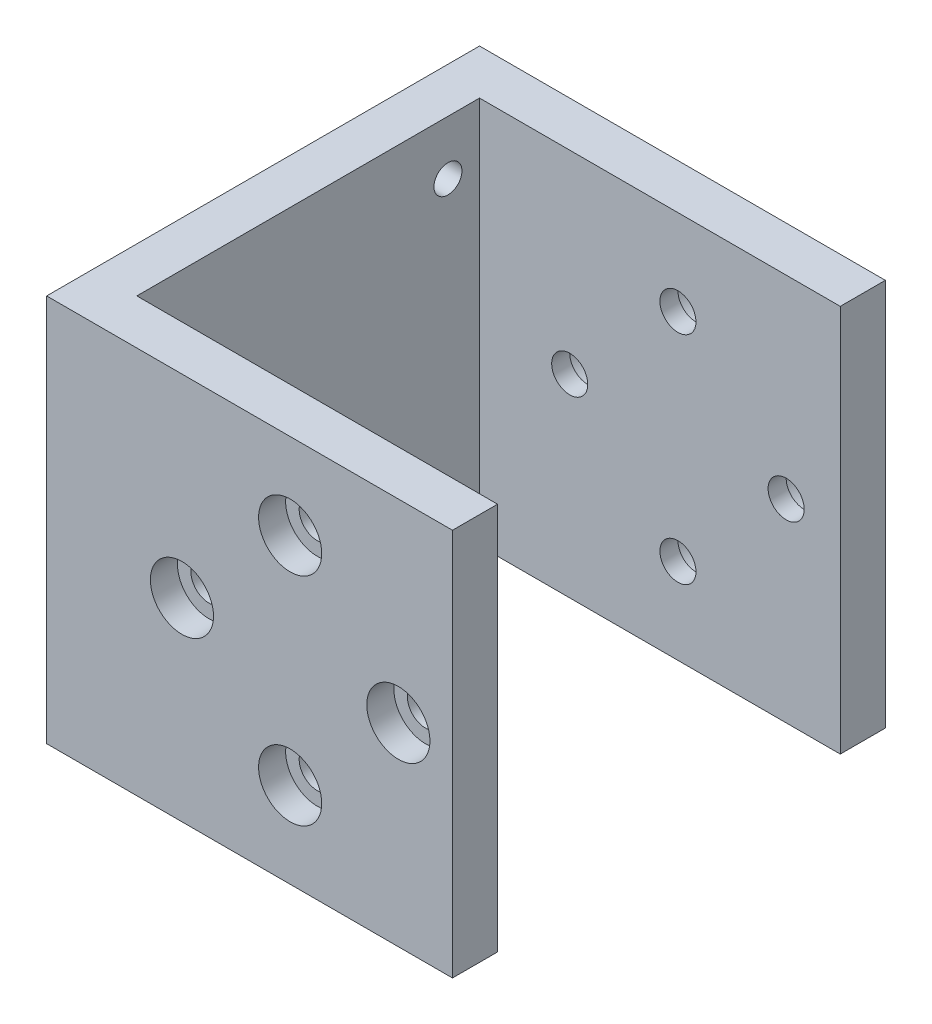
ISO-10303-21;
HEADER;
FILE_DESCRIPTION(('STEP AP214'),'2;1');
FILE_NAME('part.step','',(''),(''),'','','');
FILE_SCHEMA(('AUTOMOTIVE_DESIGN { 1 0 10303 214 1 1 1 1 }'));
ENDSEC;
DATA;
#1=APPLICATION_CONTEXT('core data for automotive mechanical design processes');
#2=APPLICATION_PROTOCOL_DEFINITION('international standard','automotive_design',2000,#1);
#3=PRODUCT_CONTEXT('',#1,'mechanical');
#4=PRODUCT('Part','Part','',(#3));
#5=PRODUCT_RELATED_PRODUCT_CATEGORY('part','',(#4));
#6=PRODUCT_DEFINITION_FORMATION('','',#4);
#7=PRODUCT_DEFINITION_CONTEXT('part definition',#1,'design');
#8=PRODUCT_DEFINITION('design','',#6,#7);
#9=PRODUCT_DEFINITION_SHAPE('','',#8);
#10=(LENGTH_UNIT() NAMED_UNIT(*) SI_UNIT(.MILLI.,.METRE.));
#11=(NAMED_UNIT(*) PLANE_ANGLE_UNIT() SI_UNIT($,.RADIAN.));
#12=(NAMED_UNIT(*) SI_UNIT($,.STERADIAN.) SOLID_ANGLE_UNIT());
#13=UNCERTAINTY_MEASURE_WITH_UNIT(LENGTH_MEASURE(1.E-05),#10,'distance_accuracy_value','');
#14=(GEOMETRIC_REPRESENTATION_CONTEXT(3) GLOBAL_UNCERTAINTY_ASSIGNED_CONTEXT((#13)) GLOBAL_UNIT_ASSIGNED_CONTEXT((#10,
#11,#12)) REPRESENTATION_CONTEXT('',''));
#15=CARTESIAN_POINT('',(0.,0.,0.));
#16=DIRECTION('',(0.,0.,1.));
#17=DIRECTION('',(1.,0.,0.));
#18=AXIS2_PLACEMENT_3D('',#15,#16,#17);
#19=CARTESIAN_POINT('',(15.,0.,24.001));
#20=DIRECTION('',(0.,0.,-1.));
#21=DIRECTION('',(-1.,0.,0.));
#22=AXIS2_PLACEMENT_3D('',#19,#20,#21);
#23=CYLINDRICAL_SURFACE('',#22,2.);
#24=CARTESIAN_POINT('',(15.,0.,-19.));
#25=DIRECTION('',(0.,0.,1.));
#26=DIRECTION('',(1.,0.,0.));
#27=AXIS2_PLACEMENT_3D('',#24,#25,#26);
#28=CIRCLE('',#27,2.);
#29=CARTESIAN_POINT('',(17.,0.,-19.));
#30=VERTEX_POINT('',#29);
#31=EDGE_CURVE('E251',#30,#30,#28,.T.);
#32=ORIENTED_EDGE('',*,*,#31,.T.);
#33=EDGE_LOOP('',(#32));
#34=FACE_BOUND('',#33,.T.);
#35=CARTESIAN_POINT('',(15.,0.,-21.));
#36=DIRECTION('',(0.,0.,-1.));
#37=DIRECTION('',(-1.,0.,0.));
#38=AXIS2_PLACEMENT_3D('',#35,#36,#37);
#39=CIRCLE('',#38,2.);
#40=CARTESIAN_POINT('',(13.,0.,-21.));
#41=VERTEX_POINT('',#40);
#42=EDGE_CURVE('E37',#41,#41,#39,.T.);
#43=ORIENTED_EDGE('',*,*,#42,.T.);
#44=EDGE_LOOP('',(#43));
#45=FACE_BOUND('',#44,.T.);
#46=ADVANCED_FACE('F33',(#34,#45),#23,.F.);
#47=CARTESIAN_POINT('',(27.,-12.,24.001));
#48=DIRECTION('',(0.,0.,-1.));
#49=DIRECTION('',(-1.,0.,0.));
#50=AXIS2_PLACEMENT_3D('',#47,#48,#49);
#51=CYLINDRICAL_SURFACE('',#50,2.);
#52=CARTESIAN_POINT('',(27.,-12.,-19.));
#53=DIRECTION('',(0.,0.,1.));
#54=DIRECTION('',(1.,0.,0.));
#55=AXIS2_PLACEMENT_3D('',#52,#53,#54);
#56=CIRCLE('',#55,2.);
#57=CARTESIAN_POINT('',(29.,-12.,-19.));
#58=VERTEX_POINT('',#57);
#59=EDGE_CURVE('E255',#58,#58,#56,.T.);
#60=ORIENTED_EDGE('',*,*,#59,.T.);
#61=EDGE_LOOP('',(#60));
#62=FACE_BOUND('',#61,.T.);
#63=CARTESIAN_POINT('',(27.,-12.,-21.));
#64=DIRECTION('',(0.,0.,-1.));
#65=DIRECTION('',(-1.,0.,0.));
#66=AXIS2_PLACEMENT_3D('',#63,#64,#65);
#67=CIRCLE('',#66,2.);
#68=CARTESIAN_POINT('',(25.,-12.,-21.));
#69=VERTEX_POINT('',#68);
#70=EDGE_CURVE('E246',#69,#69,#67,.T.);
#71=ORIENTED_EDGE('',*,*,#70,.T.);
#72=EDGE_LOOP('',(#71));
#73=FACE_BOUND('',#72,.T.);
#74=ADVANCED_FACE('F308',(#62,#73),#51,.F.);
#75=CARTESIAN_POINT('',(39.,0.,24.001));
#76=DIRECTION('',(0.,0.,-1.));
#77=DIRECTION('',(-1.,0.,0.));
#78=AXIS2_PLACEMENT_3D('',#75,#76,#77);
#79=CYLINDRICAL_SURFACE('',#78,2.);
#80=CARTESIAN_POINT('',(39.,0.,-19.));
#81=DIRECTION('',(0.,0.,1.));
#82=DIRECTION('',(1.,0.,0.));
#83=AXIS2_PLACEMENT_3D('',#80,#81,#82);
#84=CIRCLE('',#83,2.);
#85=CARTESIAN_POINT('',(41.,0.,-19.));
#86=VERTEX_POINT('',#85);
#87=EDGE_CURVE('E259',#86,#86,#84,.T.);
#88=ORIENTED_EDGE('',*,*,#87,.T.);
#89=EDGE_LOOP('',(#88));
#90=FACE_BOUND('',#89,.T.);
#91=CARTESIAN_POINT('',(39.,0.,-21.));
#92=DIRECTION('',(0.,0.,-1.));
#93=DIRECTION('',(-1.,0.,0.));
#94=AXIS2_PLACEMENT_3D('',#91,#92,#93);
#95=CIRCLE('',#94,2.);
#96=CARTESIAN_POINT('',(37.,0.,-21.));
#97=VERTEX_POINT('',#96);
#98=EDGE_CURVE('E243',#97,#97,#95,.T.);
#99=ORIENTED_EDGE('',*,*,#98,.T.);
#100=EDGE_LOOP('',(#99));
#101=FACE_BOUND('',#100,.T.);
#102=ADVANCED_FACE('F313',(#90,#101),#79,.F.);
#103=CARTESIAN_POINT('',(27.,12.,24.001));
#104=DIRECTION('',(0.,0.,-1.));
#105=DIRECTION('',(-1.,0.,0.));
#106=AXIS2_PLACEMENT_3D('',#103,#104,#105);
#107=CYLINDRICAL_SURFACE('',#106,2.);
#108=CARTESIAN_POINT('',(27.,12.,-19.));
#109=DIRECTION('',(0.,0.,1.));
#110=DIRECTION('',(1.,0.,0.));
#111=AXIS2_PLACEMENT_3D('',#108,#109,#110);
#112=CIRCLE('',#111,2.);
#113=CARTESIAN_POINT('',(29.,12.,-19.));
#114=VERTEX_POINT('',#113);
#115=EDGE_CURVE('E132',#114,#114,#112,.T.);
#116=ORIENTED_EDGE('',*,*,#115,.T.);
#117=EDGE_LOOP('',(#116));
#118=FACE_BOUND('',#117,.T.);
#119=CARTESIAN_POINT('',(27.,12.,-21.));
#120=DIRECTION('',(0.,0.,-1.));
#121=DIRECTION('',(-1.,0.,0.));
#122=AXIS2_PLACEMENT_3D('',#119,#120,#121);
#123=CIRCLE('',#122,2.);
#124=CARTESIAN_POINT('',(25.,12.,-21.));
#125=VERTEX_POINT('',#124);
#126=EDGE_CURVE('E240',#125,#125,#123,.T.);
#127=ORIENTED_EDGE('',*,*,#126,.T.);
#128=EDGE_LOOP('',(#127));
#129=FACE_BOUND('',#128,.T.);
#130=ADVANCED_FACE('F372',(#118,#129),#107,.F.);
#131=CARTESIAN_POINT('',(15.,0.,-24.001));
#132=DIRECTION('',(0.,0.,1.));
#133=DIRECTION('',(1.,0.,0.));
#134=AXIS2_PLACEMENT_3D('',#131,#132,#133);
#135=CYLINDRICAL_SURFACE('',#134,2.);
#136=CARTESIAN_POINT('',(15.,0.,19.));
#137=DIRECTION('',(0.,0.,1.));
#138=DIRECTION('',(1.,0.,0.));
#139=AXIS2_PLACEMENT_3D('',#136,#137,#138);
#140=CIRCLE('',#139,2.);
#141=CARTESIAN_POINT('',(17.,0.,19.));
#142=VERTEX_POINT('',#141);
#143=EDGE_CURVE('E170',#142,#142,#140,.F.);
#144=ORIENTED_EDGE('',*,*,#143,.T.);
#145=EDGE_LOOP('',(#144));
#146=FACE_BOUND('',#145,.T.);
#147=CARTESIAN_POINT('',(15.,0.,21.));
#148=DIRECTION('',(0.,0.,1.));
#149=DIRECTION('',(1.,0.,0.));
#150=AXIS2_PLACEMENT_3D('',#147,#148,#149);
#151=CIRCLE('',#150,2.);
#152=CARTESIAN_POINT('',(17.,0.,21.));
#153=VERTEX_POINT('',#152);
#154=EDGE_CURVE('E173',#153,#153,#151,.F.);
#155=ORIENTED_EDGE('',*,*,#154,.F.);
#156=EDGE_LOOP('',(#155));
#157=FACE_BOUND('',#156,.T.);
#158=ADVANCED_FACE('F368',(#146,#157),#135,.F.);
#159=CARTESIAN_POINT('',(27.,-12.,-24.001));
#160=DIRECTION('',(0.,0.,1.));
#161=DIRECTION('',(1.,0.,0.));
#162=AXIS2_PLACEMENT_3D('',#159,#160,#161);
#163=CYLINDRICAL_SURFACE('',#162,2.);
#164=CARTESIAN_POINT('',(27.,-12.,19.));
#165=DIRECTION('',(0.,0.,1.));
#166=DIRECTION('',(1.,0.,0.));
#167=AXIS2_PLACEMENT_3D('',#164,#165,#166);
#168=CIRCLE('',#167,2.);
#169=CARTESIAN_POINT('',(29.,-12.,19.));
#170=VERTEX_POINT('',#169);
#171=EDGE_CURVE('E167',#170,#170,#168,.F.);
#172=ORIENTED_EDGE('',*,*,#171,.T.);
#173=EDGE_LOOP('',(#172));
#174=FACE_BOUND('',#173,.T.);
#175=CARTESIAN_POINT('',(27.,-12.,21.));
#176=DIRECTION('',(0.,0.,1.));
#177=DIRECTION('',(1.,0.,0.));
#178=AXIS2_PLACEMENT_3D('',#175,#176,#177);
#179=CIRCLE('',#178,2.);
#180=CARTESIAN_POINT('',(29.,-12.,21.));
#181=VERTEX_POINT('',#180);
#182=EDGE_CURVE('E235',#181,#181,#179,.F.);
#183=ORIENTED_EDGE('',*,*,#182,.F.);
#184=EDGE_LOOP('',(#183));
#185=FACE_BOUND('',#184,.T.);
#186=ADVANCED_FACE('F364',(#174,#185),#163,.F.);
#187=CARTESIAN_POINT('',(39.,0.,-24.001));
#188=DIRECTION('',(0.,0.,1.));
#189=DIRECTION('',(1.,0.,0.));
#190=AXIS2_PLACEMENT_3D('',#187,#188,#189);
#191=CYLINDRICAL_SURFACE('',#190,2.);
#192=CARTESIAN_POINT('',(39.,0.,19.));
#193=DIRECTION('',(0.,0.,1.));
#194=DIRECTION('',(1.,0.,0.));
#195=AXIS2_PLACEMENT_3D('',#192,#193,#194);
#196=CIRCLE('',#195,2.);
#197=CARTESIAN_POINT('',(41.,0.,19.));
#198=VERTEX_POINT('',#197);
#199=EDGE_CURVE('E164',#198,#198,#196,.F.);
#200=ORIENTED_EDGE('',*,*,#199,.T.);
#201=EDGE_LOOP('',(#200));
#202=FACE_BOUND('',#201,.T.);
#203=CARTESIAN_POINT('',(39.,0.,21.));
#204=DIRECTION('',(0.,0.,1.));
#205=DIRECTION('',(1.,0.,0.));
#206=AXIS2_PLACEMENT_3D('',#203,#204,#205);
#207=CIRCLE('',#206,2.);
#208=CARTESIAN_POINT('',(41.,0.,21.));
#209=VERTEX_POINT('',#208);
#210=EDGE_CURVE('E232',#209,#209,#207,.F.);
#211=ORIENTED_EDGE('',*,*,#210,.F.);
#212=EDGE_LOOP('',(#211));
#213=FACE_BOUND('',#212,.T.);
#214=ADVANCED_FACE('F360',(#202,#213),#191,.F.);
#215=CARTESIAN_POINT('',(27.,12.,-24.001));
#216=DIRECTION('',(0.,0.,1.));
#217=DIRECTION('',(1.,0.,0.));
#218=AXIS2_PLACEMENT_3D('',#215,#216,#217);
#219=CYLINDRICAL_SURFACE('',#218,2.);
#220=CARTESIAN_POINT('',(27.,12.,19.));
#221=DIRECTION('',(0.,0.,1.));
#222=DIRECTION('',(1.,0.,0.));
#223=AXIS2_PLACEMENT_3D('',#220,#221,#222);
#224=CIRCLE('',#223,2.);
#225=CARTESIAN_POINT('',(29.,12.,19.));
#226=VERTEX_POINT('',#225);
#227=EDGE_CURVE('E160',#226,#226,#224,.F.);
#228=ORIENTED_EDGE('',*,*,#227,.T.);
#229=EDGE_LOOP('',(#228));
#230=FACE_BOUND('',#229,.T.);
#231=CARTESIAN_POINT('',(27.,12.,21.));
#232=DIRECTION('',(0.,0.,1.));
#233=DIRECTION('',(1.,0.,0.));
#234=AXIS2_PLACEMENT_3D('',#231,#232,#233);
#235=CIRCLE('',#234,2.);
#236=CARTESIAN_POINT('',(29.,12.,21.));
#237=VERTEX_POINT('',#236);
#238=EDGE_CURVE('E139',#237,#237,#235,.F.);
#239=ORIENTED_EDGE('',*,*,#238,.F.);
#240=EDGE_LOOP('',(#239));
#241=FACE_BOUND('',#240,.T.);
#242=ADVANCED_FACE('F357',(#230,#241),#219,.F.);
#243=CARTESIAN_POINT('',(5.,-21.5,24.));
#244=DIRECTION('',(0.,0.,-1.));
#245=DIRECTION('',(-1.,0.,0.));
#246=AXIS2_PLACEMENT_3D('',#243,#244,#245);
#247=PLANE('',#246);
#248=CARTESIAN_POINT('',(27.,12.,24.));
#249=DIRECTION('',(0.,0.,1.));
#250=DIRECTION('',(1.,0.,0.));
#251=AXIS2_PLACEMENT_3D('',#248,#249,#250);
#252=CIRCLE('',#251,3.5);
#253=CARTESIAN_POINT('',(30.5,12.,24.));
#254=VERTEX_POINT('',#253);
#255=EDGE_CURVE('E140',#254,#254,#252,.T.);
#256=ORIENTED_EDGE('',*,*,#255,.F.);
#257=EDGE_LOOP('',(#256));
#258=FACE_BOUND('',#257,.T.);
#259=CARTESIAN_POINT('',(39.,0.,24.));
#260=DIRECTION('',(0.,0.,1.));
#261=DIRECTION('',(1.,0.,0.));
#262=AXIS2_PLACEMENT_3D('',#259,#260,#261);
#263=CIRCLE('',#262,3.5);
#264=CARTESIAN_POINT('',(42.5,0.,24.));
#265=VERTEX_POINT('',#264);
#266=EDGE_CURVE('E146',#265,#265,#263,.T.);
#267=ORIENTED_EDGE('',*,*,#266,.F.);
#268=EDGE_LOOP('',(#267));
#269=FACE_BOUND('',#268,.T.);
#270=CARTESIAN_POINT('',(27.,-12.,24.));
#271=DIRECTION('',(0.,0.,1.));
#272=DIRECTION('',(1.,0.,0.));
#273=AXIS2_PLACEMENT_3D('',#270,#271,#272);
#274=CIRCLE('',#273,3.5);
#275=CARTESIAN_POINT('',(30.5,-12.,24.));
#276=VERTEX_POINT('',#275);
#277=EDGE_CURVE('E152',#276,#276,#274,.T.);
#278=ORIENTED_EDGE('',*,*,#277,.F.);
#279=EDGE_LOOP('',(#278));
#280=FACE_BOUND('',#279,.T.);
#281=CARTESIAN_POINT('',(15.,0.,24.));
#282=DIRECTION('',(0.,0.,1.));
#283=DIRECTION('',(1.,0.,0.));
#284=AXIS2_PLACEMENT_3D('',#281,#282,#283);
#285=CIRCLE('',#284,3.5);
#286=CARTESIAN_POINT('',(18.5,0.,24.));
#287=VERTEX_POINT('',#286);
#288=EDGE_CURVE('E135',#287,#287,#285,.T.);
#289=ORIENTED_EDGE('',*,*,#288,.F.);
#290=EDGE_LOOP('',(#289));
#291=FACE_BOUND('',#290,.T.);
#292=DIRECTION('',(0.,-1.,0.));
#293=VECTOR('',#292,1.);
#294=CARTESIAN_POINT('',(0.,-21.5,24.));
#295=LINE('',#294,#293);
#296=CARTESIAN_POINT('',(0.,21.5,24.));
#297=VERTEX_POINT('',#296);
#298=CARTESIAN_POINT('',(0.,-21.5,24.));
#299=VERTEX_POINT('',#298);
#300=EDGE_CURVE('E216',#297,#299,#295,.T.);
#301=ORIENTED_EDGE('',*,*,#300,.T.);
#302=DIRECTION('',(-1.,0.,0.));
#303=VECTOR('',#302,1.);
#304=CARTESIAN_POINT('',(5.,-21.5,24.));
#305=LINE('',#304,#303);
#306=CARTESIAN_POINT('',(45.,-21.5,24.));
#307=VERTEX_POINT('',#306);
#308=EDGE_CURVE('E11',#307,#299,#305,.T.);
#309=ORIENTED_EDGE('',*,*,#308,.F.);
#310=DIRECTION('',(0.,-1.,0.));
#311=VECTOR('',#310,1.);
#312=CARTESIAN_POINT('',(45.,21.5,24.));
#313=LINE('',#312,#311);
#314=CARTESIAN_POINT('',(45.,21.5,24.));
#315=VERTEX_POINT('',#314);
#316=EDGE_CURVE('E174',#315,#307,#313,.T.);
#317=ORIENTED_EDGE('',*,*,#316,.F.);
#318=DIRECTION('',(-1.,0.,0.));
#319=VECTOR('',#318,1.);
#320=CARTESIAN_POINT('',(5.,21.5,24.));
#321=LINE('',#320,#319);
#322=EDGE_CURVE('E110',#315,#297,#321,.T.);
#323=ORIENTED_EDGE('',*,*,#322,.T.);
#324=EDGE_LOOP('',(#301,#309,#317,#323));
#325=FACE_BOUND('',#324,.T.);
#326=ADVANCED_FACE('F35',(#258,#269,#280,#291,#325),#247,.F.);
#327=CARTESIAN_POINT('',(5.,-21.5,-24.));
#328=DIRECTION('',(0.,1.,0.));
#329=DIRECTION('',(0.,0.,1.));
#330=AXIS2_PLACEMENT_3D('',#327,#328,#329);
#331=PLANE('',#330);
#332=DIRECTION('',(0.,0.,-1.));
#333=VECTOR('',#332,1.);
#334=CARTESIAN_POINT('',(0.,-21.5,-24.));
#335=LINE('',#334,#333);
#336=CARTESIAN_POINT('',(0.,-21.5,-24.));
#337=VERTEX_POINT('',#336);
#338=EDGE_CURVE('E223',#299,#337,#335,.T.);
#339=ORIENTED_EDGE('',*,*,#338,.T.);
#340=DIRECTION('',(-1.,0.,0.));
#341=VECTOR('',#340,1.);
#342=CARTESIAN_POINT('',(5.,-21.5,-24.));
#343=LINE('',#342,#341);
#344=CARTESIAN_POINT('',(45.,-21.5,-24.));
#345=VERTEX_POINT('',#344);
#346=EDGE_CURVE('E42',#345,#337,#343,.T.);
#347=ORIENTED_EDGE('',*,*,#346,.F.);
#348=DIRECTION('',(0.,0.,1.));
#349=VECTOR('',#348,1.);
#350=CARTESIAN_POINT('',(45.,-21.5,-24.));
#351=LINE('',#350,#349);
#352=CARTESIAN_POINT('',(45.,-21.5,-19.));
#353=VERTEX_POINT('',#352);
#354=EDGE_CURVE('E119',#345,#353,#351,.T.);
#355=ORIENTED_EDGE('',*,*,#354,.T.);
#356=DIRECTION('',(-1.,0.,0.));
#357=VECTOR('',#356,1.);
#358=CARTESIAN_POINT('',(45.,-21.5,-19.));
#359=LINE('',#358,#357);
#360=CARTESIAN_POINT('',(5.,-21.5,-19.));
#361=VERTEX_POINT('',#360);
#362=EDGE_CURVE('E130',#353,#361,#359,.T.);
#363=ORIENTED_EDGE('',*,*,#362,.T.);
#364=DIRECTION('',(0.,0.,-1.));
#365=VECTOR('',#364,1.);
#366=CARTESIAN_POINT('',(5.,-21.5,-24.));
#367=LINE('',#366,#365);
#368=CARTESIAN_POINT('',(5.,-21.5,19.));
#369=VERTEX_POINT('',#368);
#370=EDGE_CURVE('E55',#369,#361,#367,.T.);
#371=ORIENTED_EDGE('',*,*,#370,.F.);
#372=DIRECTION('',(-1.,0.,0.));
#373=VECTOR('',#372,1.);
#374=CARTESIAN_POINT('',(45.,-21.5,19.));
#375=LINE('',#374,#373);
#376=CARTESIAN_POINT('',(45.,-21.5,19.));
#377=VERTEX_POINT('',#376);
#378=EDGE_CURVE('E189',#377,#369,#375,.T.);
#379=ORIENTED_EDGE('',*,*,#378,.F.);
#380=DIRECTION('',(0.,0.,-1.));
#381=VECTOR('',#380,1.);
#382=CARTESIAN_POINT('',(45.,-21.5,24.));
#383=LINE('',#382,#381);
#384=EDGE_CURVE('E177',#307,#377,#383,.T.);
#385=ORIENTED_EDGE('',*,*,#384,.F.);
#386=ORIENTED_EDGE('',*,*,#308,.T.);
#387=EDGE_LOOP('',(#339,#347,#355,#363,#371,#379,#385,#386));
#388=FACE_BOUND('',#387,.T.);
#389=ADVANCED_FACE('F407',(#388),#331,.F.);
#390=CARTESIAN_POINT('',(5.,-21.5,-24.));
#391=DIRECTION('',(0.,0.,1.));
#392=DIRECTION('',(1.,0.,0.));
#393=AXIS2_PLACEMENT_3D('',#390,#391,#392);
#394=PLANE('',#393);
#395=CARTESIAN_POINT('',(27.,12.,-24.));
#396=DIRECTION('',(0.,0.,1.));
#397=DIRECTION('',(1.,0.,0.));
#398=AXIS2_PLACEMENT_3D('',#395,#396,#397);
#399=CIRCLE('',#398,3.5);
#400=CARTESIAN_POINT('',(30.5,12.,-24.));
#401=VERTEX_POINT('',#400);
#402=EDGE_CURVE('E284',#401,#401,#399,.T.);
#403=ORIENTED_EDGE('',*,*,#402,.T.);
#404=EDGE_LOOP('',(#403));
#405=FACE_BOUND('',#404,.T.);
#406=CARTESIAN_POINT('',(39.,0.,-24.));
#407=DIRECTION('',(0.,0.,1.));
#408=DIRECTION('',(1.,0.,0.));
#409=AXIS2_PLACEMENT_3D('',#406,#407,#408);
#410=CIRCLE('',#409,3.5);
#411=CARTESIAN_POINT('',(42.5,0.,-24.));
#412=VERTEX_POINT('',#411);
#413=EDGE_CURVE('E278',#412,#412,#410,.T.);
#414=ORIENTED_EDGE('',*,*,#413,.T.);
#415=EDGE_LOOP('',(#414));
#416=FACE_BOUND('',#415,.T.);
#417=CARTESIAN_POINT('',(27.,-12.,-24.));
#418=DIRECTION('',(0.,0.,1.));
#419=DIRECTION('',(1.,0.,0.));
#420=AXIS2_PLACEMENT_3D('',#417,#418,#419);
#421=CIRCLE('',#420,3.5);
#422=CARTESIAN_POINT('',(30.5,-12.,-24.));
#423=VERTEX_POINT('',#422);
#424=EDGE_CURVE('E272',#423,#423,#421,.T.);
#425=ORIENTED_EDGE('',*,*,#424,.T.);
#426=EDGE_LOOP('',(#425));
#427=FACE_BOUND('',#426,.T.);
#428=CARTESIAN_POINT('',(15.,0.,-24.));
#429=DIRECTION('',(0.,0.,1.));
#430=DIRECTION('',(1.,0.,0.));
#431=AXIS2_PLACEMENT_3D('',#428,#429,#430);
#432=CIRCLE('',#431,3.5);
#433=CARTESIAN_POINT('',(18.5,0.,-24.));
#434=VERTEX_POINT('',#433);
#435=EDGE_CURVE('E266',#434,#434,#432,.T.);
#436=ORIENTED_EDGE('',*,*,#435,.T.);
#437=EDGE_LOOP('',(#436));
#438=FACE_BOUND('',#437,.T.);
#439=DIRECTION('',(0.,1.,0.));
#440=VECTOR('',#439,1.);
#441=CARTESIAN_POINT('',(0.,-21.5,-24.));
#442=LINE('',#441,#440);
#443=CARTESIAN_POINT('',(0.,21.5,-24.));
#444=VERTEX_POINT('',#443);
#445=EDGE_CURVE('E106',#337,#444,#442,.T.);
#446=ORIENTED_EDGE('',*,*,#445,.T.);
#447=DIRECTION('',(-1.,0.,0.));
#448=VECTOR('',#447,1.);
#449=CARTESIAN_POINT('',(5.,21.5,-24.));
#450=LINE('',#449,#448);
#451=CARTESIAN_POINT('',(45.,21.5,-24.));
#452=VERTEX_POINT('',#451);
#453=EDGE_CURVE('E99',#452,#444,#450,.T.);
#454=ORIENTED_EDGE('',*,*,#453,.F.);
#455=DIRECTION('',(0.,-1.,0.));
#456=VECTOR('',#455,1.);
#457=CARTESIAN_POINT('',(45.,21.5,-24.));
#458=LINE('',#457,#456);
#459=EDGE_CURVE('E103',#452,#345,#458,.T.);
#460=ORIENTED_EDGE('',*,*,#459,.T.);
#461=ORIENTED_EDGE('',*,*,#346,.T.);
#462=EDGE_LOOP('',(#446,#454,#460,#461));
#463=FACE_BOUND('',#462,.T.);
#464=ADVANCED_FACE('F101',(#405,#416,#427,#438,#463),#394,.F.);
#465=CARTESIAN_POINT('',(5.,21.5,-24.));
#466=DIRECTION('',(0.,-1.,0.));
#467=DIRECTION('',(0.,0.,-1.));
#468=AXIS2_PLACEMENT_3D('',#465,#466,#467);
#469=PLANE('',#468);
#470=DIRECTION('',(0.,0.,1.));
#471=VECTOR('',#470,1.);
#472=CARTESIAN_POINT('',(0.,21.5,-24.));
#473=LINE('',#472,#471);
#474=EDGE_CURVE('E219',#444,#297,#473,.T.);
#475=ORIENTED_EDGE('',*,*,#474,.T.);
#476=ORIENTED_EDGE('',*,*,#322,.F.);
#477=DIRECTION('',(0.,0.,1.));
#478=VECTOR('',#477,1.);
#479=CARTESIAN_POINT('',(45.,21.5,24.));
#480=LINE('',#479,#478);
#481=CARTESIAN_POINT('',(45.,21.5,19.));
#482=VERTEX_POINT('',#481);
#483=EDGE_CURVE('E181',#482,#315,#480,.T.);
#484=ORIENTED_EDGE('',*,*,#483,.F.);
#485=DIRECTION('',(-1.,0.,0.));
#486=VECTOR('',#485,1.);
#487=CARTESIAN_POINT('',(45.,21.5,19.));
#488=LINE('',#487,#486);
#489=CARTESIAN_POINT('',(5.,21.5,19.));
#490=VERTEX_POINT('',#489);
#491=EDGE_CURVE('E184',#482,#490,#488,.T.);
#492=ORIENTED_EDGE('',*,*,#491,.T.);
#493=DIRECTION('',(0.,0.,1.));
#494=VECTOR('',#493,1.);
#495=CARTESIAN_POINT('',(5.,21.5,-24.));
#496=LINE('',#495,#494);
#497=CARTESIAN_POINT('',(5.,21.5,-19.));
#498=VERTEX_POINT('',#497);
#499=EDGE_CURVE('E218',#498,#490,#496,.T.);
#500=ORIENTED_EDGE('',*,*,#499,.F.);
#501=DIRECTION('',(-1.,0.,0.));
#502=VECTOR('',#501,1.);
#503=CARTESIAN_POINT('',(45.,21.5,-19.));
#504=LINE('',#503,#502);
#505=CARTESIAN_POINT('',(45.,21.5,-19.));
#506=VERTEX_POINT('',#505);
#507=EDGE_CURVE('E123',#506,#498,#504,.T.);
#508=ORIENTED_EDGE('',*,*,#507,.F.);
#509=DIRECTION('',(0.,0.,-1.));
#510=VECTOR('',#509,1.);
#511=CARTESIAN_POINT('',(45.,21.5,-24.));
#512=LINE('',#511,#510);
#513=EDGE_CURVE('E116',#506,#452,#512,.T.);
#514=ORIENTED_EDGE('',*,*,#513,.T.);
#515=ORIENTED_EDGE('',*,*,#453,.T.);
#516=EDGE_LOOP('',(#475,#476,#484,#492,#500,#508,#514,#515));
#517=FACE_BOUND('',#516,.T.);
#518=ADVANCED_FACE('F121',(#517),#469,.F.);
#519=CARTESIAN_POINT('',(5.,0.,0.));
#520=DIRECTION('',(1.,0.,0.));
#521=DIRECTION('',(0.,0.,-1.));
#522=AXIS2_PLACEMENT_3D('',#519,#520,#521);
#523=PLANE('',#522);
#524=DIRECTION('',(0.,1.,0.));
#525=VECTOR('',#524,1.);
#526=CARTESIAN_POINT('',(5.,21.5,-19.));
#527=LINE('',#526,#525);
#528=EDGE_CURVE('E50',#361,#498,#527,.T.);
#529=ORIENTED_EDGE('',*,*,#528,.T.);
#530=ORIENTED_EDGE('',*,*,#499,.T.);
#531=DIRECTION('',(0.,1.,0.));
#532=VECTOR('',#531,1.);
#533=CARTESIAN_POINT('',(5.,21.5,19.));
#534=LINE('',#533,#532);
#535=EDGE_CURVE('E163',#369,#490,#534,.T.);
#536=ORIENTED_EDGE('',*,*,#535,.F.);
#537=ORIENTED_EDGE('',*,*,#370,.T.);
#538=EDGE_LOOP('',(#529,#530,#536,#537));
#539=FACE_BOUND('',#538,.T.);
#540=CARTESIAN_POINT('',(5.,-15.5,15.4999999999991));
#541=DIRECTION('',(1.,0.,0.));
#542=DIRECTION('',(0.,0.,-1.));
#543=AXIS2_PLACEMENT_3D('',#540,#541,#542);
#544=CIRCLE('',#543,1.55);
#545=CARTESIAN_POINT('',(5.,-15.5,13.9499999999991));
#546=VERTEX_POINT('',#545);
#547=EDGE_CURVE('E192',#546,#546,#544,.T.);
#548=ORIENTED_EDGE('',*,*,#547,.F.);
#549=EDGE_LOOP('',(#548));
#550=FACE_BOUND('',#549,.T.);
#551=CARTESIAN_POINT('',(5.,-15.4999999999991,-15.5000000000009));
#552=DIRECTION('',(1.,0.,0.));
#553=DIRECTION('',(0.,0.,-1.));
#554=AXIS2_PLACEMENT_3D('',#551,#552,#553);
#555=CIRCLE('',#554,1.55);
#556=CARTESIAN_POINT('',(5.,-15.4999999999991,-17.0500000000009));
#557=VERTEX_POINT('',#556);
#558=EDGE_CURVE('E201',#557,#557,#555,.T.);
#559=ORIENTED_EDGE('',*,*,#558,.F.);
#560=EDGE_LOOP('',(#559));
#561=FACE_BOUND('',#560,.T.);
#562=CARTESIAN_POINT('',(5.,15.5000000000009,-15.5));
#563=DIRECTION('',(1.,0.,0.));
#564=DIRECTION('',(0.,0.,-1.));
#565=AXIS2_PLACEMENT_3D('',#562,#563,#564);
#566=CIRCLE('',#565,1.55);
#567=CARTESIAN_POINT('',(5.,15.5000000000009,-17.05));
#568=VERTEX_POINT('',#567);
#569=EDGE_CURVE('E193',#568,#568,#566,.T.);
#570=ORIENTED_EDGE('',*,*,#569,.F.);
#571=EDGE_LOOP('',(#570));
#572=FACE_BOUND('',#571,.T.);
#573=CARTESIAN_POINT('',(5.,15.5,15.5));
#574=DIRECTION('',(1.,0.,0.));
#575=DIRECTION('',(0.,0.,-1.));
#576=AXIS2_PLACEMENT_3D('',#573,#574,#575);
#577=CIRCLE('',#576,1.55);
#578=CARTESIAN_POINT('',(5.,15.5,13.95));
#579=VERTEX_POINT('',#578);
#580=EDGE_CURVE('E200',#579,#579,#577,.T.);
#581=ORIENTED_EDGE('',*,*,#580,.F.);
#582=EDGE_LOOP('',(#581));
#583=FACE_BOUND('',#582,.T.);
#584=ADVANCED_FACE('F398',(#539,#550,#561,#572,#583),#523,.T.);
#585=CARTESIAN_POINT('',(0.,0.,0.));
#586=DIRECTION('',(1.,0.,0.));
#587=DIRECTION('',(0.,0.,-1.));
#588=AXIS2_PLACEMENT_3D('',#585,#586,#587);
#589=PLANE('',#588);
#590=CARTESIAN_POINT('',(0.,-15.5,15.4999999999991));
#591=DIRECTION('',(1.,0.,0.));
#592=DIRECTION('',(0.,0.,-1.));
#593=AXIS2_PLACEMENT_3D('',#590,#591,#592);
#594=CIRCLE('',#593,1.55);
#595=CARTESIAN_POINT('',(0.,-15.5,13.9499999999991));
#596=VERTEX_POINT('',#595);
#597=EDGE_CURVE('E204',#596,#596,#594,.F.);
#598=ORIENTED_EDGE('',*,*,#597,.F.);
#599=EDGE_LOOP('',(#598));
#600=FACE_BOUND('',#599,.T.);
#601=CARTESIAN_POINT('',(0.,-15.4999999999991,-15.5000000000009));
#602=DIRECTION('',(1.,0.,0.));
#603=DIRECTION('',(0.,0.,-1.));
#604=AXIS2_PLACEMENT_3D('',#601,#602,#603);
#605=CIRCLE('',#604,1.55);
#606=CARTESIAN_POINT('',(0.,-15.4999999999991,-17.0500000000009));
#607=VERTEX_POINT('',#606);
#608=EDGE_CURVE('E197',#607,#607,#605,.F.);
#609=ORIENTED_EDGE('',*,*,#608,.F.);
#610=EDGE_LOOP('',(#609));
#611=FACE_BOUND('',#610,.T.);
#612=CARTESIAN_POINT('',(0.,15.5000000000009,-15.5));
#613=DIRECTION('',(1.,0.,0.));
#614=DIRECTION('',(0.,0.,-1.));
#615=AXIS2_PLACEMENT_3D('',#612,#613,#614);
#616=CIRCLE('',#615,1.55);
#617=CARTESIAN_POINT('',(0.,15.5000000000009,-17.05));
#618=VERTEX_POINT('',#617);
#619=EDGE_CURVE('E196',#618,#618,#616,.F.);
#620=ORIENTED_EDGE('',*,*,#619,.F.);
#621=EDGE_LOOP('',(#620));
#622=FACE_BOUND('',#621,.T.);
#623=CARTESIAN_POINT('',(0.,15.5,15.5));
#624=DIRECTION('',(1.,0.,0.));
#625=DIRECTION('',(0.,0.,-1.));
#626=AXIS2_PLACEMENT_3D('',#623,#624,#625);
#627=CIRCLE('',#626,1.55);
#628=CARTESIAN_POINT('',(0.,15.5,13.95));
#629=VERTEX_POINT('',#628);
#630=EDGE_CURVE('E213',#629,#629,#627,.F.);
#631=ORIENTED_EDGE('',*,*,#630,.F.);
#632=EDGE_LOOP('',(#631));
#633=FACE_BOUND('',#632,.T.);
#634=ORIENTED_EDGE('',*,*,#300,.F.);
#635=ORIENTED_EDGE('',*,*,#474,.F.);
#636=ORIENTED_EDGE('',*,*,#445,.F.);
#637=ORIENTED_EDGE('',*,*,#338,.F.);
#638=EDGE_LOOP('',(#634,#635,#636,#637));
#639=FACE_BOUND('',#638,.T.);
#640=ADVANCED_FACE('F396',(#600,#611,#622,#633,#639),#589,.F.);
#641=CARTESIAN_POINT('',(-0.00100000000000273,15.5,15.5));
#642=DIRECTION('',(1.,0.,0.));
#643=DIRECTION('',(0.,0.,-1.));
#644=AXIS2_PLACEMENT_3D('',#641,#642,#643);
#645=CYLINDRICAL_SURFACE('',#644,1.55);
#646=ORIENTED_EDGE('',*,*,#580,.T.);
#647=EDGE_LOOP('',(#646));
#648=FACE_BOUND('',#647,.T.);
#649=ORIENTED_EDGE('',*,*,#630,.T.);
#650=EDGE_LOOP('',(#649));
#651=FACE_BOUND('',#650,.T.);
#652=ADVANCED_FACE('F386',(#648,#651),#645,.F.);
#653=CARTESIAN_POINT('',(-0.001000000000001,15.5000000000009,-15.5));
#654=DIRECTION('',(1.,0.,0.));
#655=DIRECTION('',(0.,0.,-1.));
#656=AXIS2_PLACEMENT_3D('',#653,#654,#655);
#657=CYLINDRICAL_SURFACE('',#656,1.55);
#658=ORIENTED_EDGE('',*,*,#569,.T.);
#659=EDGE_LOOP('',(#658));
#660=FACE_BOUND('',#659,.T.);
#661=ORIENTED_EDGE('',*,*,#619,.T.);
#662=EDGE_LOOP('',(#661));
#663=FACE_BOUND('',#662,.T.);
#664=ADVANCED_FACE('F382',(#660,#663),#657,.F.);
#665=CARTESIAN_POINT('',(-0.001000000000001,-15.4999999999991,-15.5000000000009));
#666=DIRECTION('',(1.,0.,0.));
#667=DIRECTION('',(0.,0.,-1.));
#668=AXIS2_PLACEMENT_3D('',#665,#666,#667);
#669=CYLINDRICAL_SURFACE('',#668,1.55);
#670=ORIENTED_EDGE('',*,*,#558,.T.);
#671=EDGE_LOOP('',(#670));
#672=FACE_BOUND('',#671,.T.);
#673=ORIENTED_EDGE('',*,*,#608,.T.);
#674=EDGE_LOOP('',(#673));
#675=FACE_BOUND('',#674,.T.);
#676=ADVANCED_FACE('F385',(#672,#675),#669,.F.);
#677=CARTESIAN_POINT('',(-0.00100000000000273,-15.5,15.4999999999991));
#678=DIRECTION('',(1.,0.,0.));
#679=DIRECTION('',(0.,0.,-1.));
#680=AXIS2_PLACEMENT_3D('',#677,#678,#679);
#681=CYLINDRICAL_SURFACE('',#680,1.55);
#682=ORIENTED_EDGE('',*,*,#547,.T.);
#683=EDGE_LOOP('',(#682));
#684=FACE_BOUND('',#683,.T.);
#685=ORIENTED_EDGE('',*,*,#597,.T.);
#686=EDGE_LOOP('',(#685));
#687=FACE_BOUND('',#686,.T.);
#688=ADVANCED_FACE('F380',(#684,#687),#681,.F.);
#689=CARTESIAN_POINT('',(45.,21.5,19.));
#690=DIRECTION('',(0.,0.,1.));
#691=DIRECTION('',(1.,0.,0.));
#692=AXIS2_PLACEMENT_3D('',#689,#690,#691);
#693=PLANE('',#692);
#694=ORIENTED_EDGE('',*,*,#227,.F.);
#695=EDGE_LOOP('',(#694));
#696=FACE_BOUND('',#695,.T.);
#697=ORIENTED_EDGE('',*,*,#199,.F.);
#698=EDGE_LOOP('',(#697));
#699=FACE_BOUND('',#698,.T.);
#700=ORIENTED_EDGE('',*,*,#171,.F.);
#701=EDGE_LOOP('',(#700));
#702=FACE_BOUND('',#701,.T.);
#703=ORIENTED_EDGE('',*,*,#143,.F.);
#704=EDGE_LOOP('',(#703));
#705=FACE_BOUND('',#704,.T.);
#706=ORIENTED_EDGE('',*,*,#535,.T.);
#707=ORIENTED_EDGE('',*,*,#491,.F.);
#708=DIRECTION('',(0.,1.,0.));
#709=VECTOR('',#708,1.);
#710=CARTESIAN_POINT('',(45.,21.5,19.));
#711=LINE('',#710,#709);
#712=EDGE_CURVE('E179',#377,#482,#711,.T.);
#713=ORIENTED_EDGE('',*,*,#712,.F.);
#714=ORIENTED_EDGE('',*,*,#378,.T.);
#715=EDGE_LOOP('',(#706,#707,#713,#714));
#716=FACE_BOUND('',#715,.T.);
#717=ADVANCED_FACE('F376',(#696,#699,#702,#705,#716),#693,.F.);
#718=CARTESIAN_POINT('',(45.,0.,0.));
#719=DIRECTION('',(1.,0.,0.));
#720=DIRECTION('',(0.,0.,-1.));
#721=AXIS2_PLACEMENT_3D('',#718,#719,#720);
#722=PLANE('',#721);
#723=ORIENTED_EDGE('',*,*,#316,.T.);
#724=ORIENTED_EDGE('',*,*,#384,.T.);
#725=ORIENTED_EDGE('',*,*,#712,.T.);
#726=ORIENTED_EDGE('',*,*,#483,.T.);
#727=EDGE_LOOP('',(#723,#724,#725,#726));
#728=FACE_BOUND('',#727,.T.);
#729=ADVANCED_FACE('F329',(#728),#722,.T.);
#730=CARTESIAN_POINT('',(27.,12.,21.));
#731=DIRECTION('',(0.,0.,1.));
#732=DIRECTION('',(1.,0.,0.));
#733=AXIS2_PLACEMENT_3D('',#730,#731,#732);
#734=PLANE('',#733);
#735=CARTESIAN_POINT('',(27.,12.,21.));
#736=DIRECTION('',(0.,0.,1.));
#737=DIRECTION('',(1.,0.,0.));
#738=AXIS2_PLACEMENT_3D('',#735,#736,#737);
#739=CIRCLE('',#738,3.5);
#740=CARTESIAN_POINT('',(30.5,12.,21.));
#741=VERTEX_POINT('',#740);
#742=EDGE_CURVE('E136',#741,#741,#739,.T.);
#743=ORIENTED_EDGE('',*,*,#742,.T.);
#744=EDGE_LOOP('',(#743));
#745=FACE_BOUND('',#744,.T.);
#746=ORIENTED_EDGE('',*,*,#238,.T.);
#747=EDGE_LOOP('',(#746));
#748=FACE_BOUND('',#747,.T.);
#749=ADVANCED_FACE('F325',(#745,#748),#734,.T.);
#750=CARTESIAN_POINT('',(27.,12.,21.));
#751=DIRECTION('',(0.,0.,1.));
#752=DIRECTION('',(1.,0.,0.));
#753=AXIS2_PLACEMENT_3D('',#750,#751,#752);
#754=CYLINDRICAL_SURFACE('',#753,3.5);
#755=ORIENTED_EDGE('',*,*,#742,.F.);
#756=EDGE_LOOP('',(#755));
#757=FACE_BOUND('',#756,.T.);
#758=ORIENTED_EDGE('',*,*,#255,.T.);
#759=EDGE_LOOP('',(#758));
#760=FACE_BOUND('',#759,.T.);
#761=ADVANCED_FACE('F328',(#757,#760),#754,.F.);
#762=CARTESIAN_POINT('',(39.,0.,21.));
#763=DIRECTION('',(0.,0.,1.));
#764=DIRECTION('',(1.,0.,0.));
#765=AXIS2_PLACEMENT_3D('',#762,#763,#764);
#766=PLANE('',#765);
#767=CARTESIAN_POINT('',(39.,0.,21.));
#768=DIRECTION('',(0.,0.,1.));
#769=DIRECTION('',(1.,0.,0.));
#770=AXIS2_PLACEMENT_3D('',#767,#768,#769);
#771=CIRCLE('',#770,3.5);
#772=CARTESIAN_POINT('',(42.5,0.,21.));
#773=VERTEX_POINT('',#772);
#774=EDGE_CURVE('E143',#773,#773,#771,.T.);
#775=ORIENTED_EDGE('',*,*,#774,.T.);
#776=EDGE_LOOP('',(#775));
#777=FACE_BOUND('',#776,.T.);
#778=ORIENTED_EDGE('',*,*,#210,.T.);
#779=EDGE_LOOP('',(#778));
#780=FACE_BOUND('',#779,.T.);
#781=ADVANCED_FACE('F333',(#777,#780),#766,.T.);
#782=CARTESIAN_POINT('',(39.,0.,21.));
#783=DIRECTION('',(0.,0.,1.));
#784=DIRECTION('',(1.,0.,0.));
#785=AXIS2_PLACEMENT_3D('',#782,#783,#784);
#786=CYLINDRICAL_SURFACE('',#785,3.5);
#787=ORIENTED_EDGE('',*,*,#774,.F.);
#788=EDGE_LOOP('',(#787));
#789=FACE_BOUND('',#788,.T.);
#790=ORIENTED_EDGE('',*,*,#266,.T.);
#791=EDGE_LOOP('',(#790));
#792=FACE_BOUND('',#791,.T.);
#793=ADVANCED_FACE('F337',(#789,#792),#786,.F.);
#794=CARTESIAN_POINT('',(27.,-12.,21.));
#795=DIRECTION('',(0.,0.,1.));
#796=DIRECTION('',(1.,0.,0.));
#797=AXIS2_PLACEMENT_3D('',#794,#795,#796);
#798=PLANE('',#797);
#799=CARTESIAN_POINT('',(27.,-12.,21.));
#800=DIRECTION('',(0.,0.,1.));
#801=DIRECTION('',(1.,0.,0.));
#802=AXIS2_PLACEMENT_3D('',#799,#800,#801);
#803=CIRCLE('',#802,3.5);
#804=CARTESIAN_POINT('',(30.5,-12.,21.));
#805=VERTEX_POINT('',#804);
#806=EDGE_CURVE('E149',#805,#805,#803,.T.);
#807=ORIENTED_EDGE('',*,*,#806,.T.);
#808=EDGE_LOOP('',(#807));
#809=FACE_BOUND('',#808,.T.);
#810=ORIENTED_EDGE('',*,*,#182,.T.);
#811=EDGE_LOOP('',(#810));
#812=FACE_BOUND('',#811,.T.);
#813=ADVANCED_FACE('F341',(#809,#812),#798,.T.);
#814=CARTESIAN_POINT('',(27.,-12.,21.));
#815=DIRECTION('',(0.,0.,1.));
#816=DIRECTION('',(1.,0.,0.));
#817=AXIS2_PLACEMENT_3D('',#814,#815,#816);
#818=CYLINDRICAL_SURFACE('',#817,3.5);
#819=ORIENTED_EDGE('',*,*,#806,.F.);
#820=EDGE_LOOP('',(#819));
#821=FACE_BOUND('',#820,.T.);
#822=ORIENTED_EDGE('',*,*,#277,.T.);
#823=EDGE_LOOP('',(#822));
#824=FACE_BOUND('',#823,.T.);
#825=ADVANCED_FACE('F345',(#821,#824),#818,.F.);
#826=CARTESIAN_POINT('',(15.,0.,21.));
#827=DIRECTION('',(0.,0.,1.));
#828=DIRECTION('',(1.,0.,0.));
#829=AXIS2_PLACEMENT_3D('',#826,#827,#828);
#830=PLANE('',#829);
#831=CARTESIAN_POINT('',(15.,0.,21.));
#832=DIRECTION('',(0.,0.,1.));
#833=DIRECTION('',(1.,0.,0.));
#834=AXIS2_PLACEMENT_3D('',#831,#832,#833);
#835=CIRCLE('',#834,3.5);
#836=CARTESIAN_POINT('',(18.5,0.,21.));
#837=VERTEX_POINT('',#836);
#838=EDGE_CURVE('E155',#837,#837,#835,.T.);
#839=ORIENTED_EDGE('',*,*,#838,.T.);
#840=EDGE_LOOP('',(#839));
#841=FACE_BOUND('',#840,.T.);
#842=ORIENTED_EDGE('',*,*,#154,.T.);
#843=EDGE_LOOP('',(#842));
#844=FACE_BOUND('',#843,.T.);
#845=ADVANCED_FACE('F349',(#841,#844),#830,.T.);
#846=CARTESIAN_POINT('',(15.,0.,21.));
#847=DIRECTION('',(0.,0.,1.));
#848=DIRECTION('',(1.,0.,0.));
#849=AXIS2_PLACEMENT_3D('',#846,#847,#848);
#850=CYLINDRICAL_SURFACE('',#849,3.5);
#851=ORIENTED_EDGE('',*,*,#838,.F.);
#852=EDGE_LOOP('',(#851));
#853=FACE_BOUND('',#852,.T.);
#854=ORIENTED_EDGE('',*,*,#288,.T.);
#855=EDGE_LOOP('',(#854));
#856=FACE_BOUND('',#855,.T.);
#857=ADVANCED_FACE('F323',(#853,#856),#850,.F.);
#858=CARTESIAN_POINT('',(45.,21.5,-19.));
#859=DIRECTION('',(0.,0.,1.));
#860=DIRECTION('',(1.,0.,0.));
#861=AXIS2_PLACEMENT_3D('',#858,#859,#860);
#862=PLANE('',#861);
#863=ORIENTED_EDGE('',*,*,#115,.F.);
#864=EDGE_LOOP('',(#863));
#865=FACE_BOUND('',#864,.T.);
#866=ORIENTED_EDGE('',*,*,#87,.F.);
#867=EDGE_LOOP('',(#866));
#868=FACE_BOUND('',#867,.T.);
#869=ORIENTED_EDGE('',*,*,#59,.F.);
#870=EDGE_LOOP('',(#869));
#871=FACE_BOUND('',#870,.T.);
#872=ORIENTED_EDGE('',*,*,#31,.F.);
#873=EDGE_LOOP('',(#872));
#874=FACE_BOUND('',#873,.T.);
#875=ORIENTED_EDGE('',*,*,#528,.F.);
#876=ORIENTED_EDGE('',*,*,#362,.F.);
#877=DIRECTION('',(0.,1.,0.));
#878=VECTOR('',#877,1.);
#879=CARTESIAN_POINT('',(45.,21.5,-19.));
#880=LINE('',#879,#878);
#881=EDGE_CURVE('E124',#353,#506,#880,.T.);
#882=ORIENTED_EDGE('',*,*,#881,.T.);
#883=ORIENTED_EDGE('',*,*,#507,.T.);
#884=EDGE_LOOP('',(#875,#876,#882,#883));
#885=FACE_BOUND('',#884,.T.);
#886=ADVANCED_FACE('F320',(#865,#868,#871,#874,#885),#862,.T.);
#887=CARTESIAN_POINT('',(45.,0.,0.));
#888=DIRECTION('',(1.,0.,0.));
#889=DIRECTION('',(0.,0.,1.));
#890=AXIS2_PLACEMENT_3D('',#887,#888,#889);
#891=PLANE('',#890);
#892=ORIENTED_EDGE('',*,*,#459,.F.);
#893=ORIENTED_EDGE('',*,*,#513,.F.);
#894=ORIENTED_EDGE('',*,*,#881,.F.);
#895=ORIENTED_EDGE('',*,*,#354,.F.);
#896=EDGE_LOOP('',(#892,#893,#894,#895));
#897=FACE_BOUND('',#896,.T.);
#898=ADVANCED_FACE('F114',(#897),#891,.T.);
#899=CARTESIAN_POINT('',(27.,12.,-21.));
#900=DIRECTION('',(0.,0.,-1.));
#901=DIRECTION('',(-1.,0.,0.));
#902=AXIS2_PLACEMENT_3D('',#899,#900,#901);
#903=CYLINDRICAL_SURFACE('',#902,3.5);
#904=CARTESIAN_POINT('',(27.,12.,-21.));
#905=DIRECTION('',(0.,0.,1.));
#906=DIRECTION('',(1.,0.,0.));
#907=AXIS2_PLACEMENT_3D('',#904,#905,#906);
#908=CIRCLE('',#907,3.5);
#909=CARTESIAN_POINT('',(30.5,12.,-21.));
#910=VERTEX_POINT('',#909);
#911=EDGE_CURVE('E244',#910,#910,#908,.T.);
#912=ORIENTED_EDGE('',*,*,#911,.T.);
#913=EDGE_LOOP('',(#912));
#914=FACE_BOUND('',#913,.T.);
#915=ORIENTED_EDGE('',*,*,#402,.F.);
#916=EDGE_LOOP('',(#915));
#917=FACE_BOUND('',#916,.T.);
#918=ADVANCED_FACE('F290',(#914,#917),#903,.F.);
#919=CARTESIAN_POINT('',(27.,12.,-21.));
#920=DIRECTION('',(0.,0.,-1.));
#921=DIRECTION('',(1.,0.,0.));
#922=AXIS2_PLACEMENT_3D('',#919,#920,#921);
#923=PLANE('',#922);
#924=ORIENTED_EDGE('',*,*,#126,.F.);
#925=EDGE_LOOP('',(#924));
#926=FACE_BOUND('',#925,.T.);
#927=ORIENTED_EDGE('',*,*,#911,.F.);
#928=EDGE_LOOP('',(#927));
#929=FACE_BOUND('',#928,.T.);
#930=ADVANCED_FACE('F293',(#926,#929),#923,.T.);
#931=CARTESIAN_POINT('',(39.,0.,-21.));
#932=DIRECTION('',(0.,0.,-1.));
#933=DIRECTION('',(-1.,0.,0.));
#934=AXIS2_PLACEMENT_3D('',#931,#932,#933);
#935=CYLINDRICAL_SURFACE('',#934,3.5);
#936=CARTESIAN_POINT('',(39.,0.,-21.));
#937=DIRECTION('',(0.,0.,1.));
#938=DIRECTION('',(1.,0.,0.));
#939=AXIS2_PLACEMENT_3D('',#936,#937,#938);
#940=CIRCLE('',#939,3.5);
#941=CARTESIAN_POINT('',(42.5,0.,-21.));
#942=VERTEX_POINT('',#941);
#943=EDGE_CURVE('E281',#942,#942,#940,.T.);
#944=ORIENTED_EDGE('',*,*,#943,.T.);
#945=EDGE_LOOP('',(#944));
#946=FACE_BOUND('',#945,.T.);
#947=ORIENTED_EDGE('',*,*,#413,.F.);
#948=EDGE_LOOP('',(#947));
#949=FACE_BOUND('',#948,.T.);
#950=ADVANCED_FACE('F295',(#946,#949),#935,.F.);
#951=CARTESIAN_POINT('',(39.,0.,-21.));
#952=DIRECTION('',(0.,0.,-1.));
#953=DIRECTION('',(1.,0.,0.));
#954=AXIS2_PLACEMENT_3D('',#951,#952,#953);
#955=PLANE('',#954);
#956=ORIENTED_EDGE('',*,*,#98,.F.);
#957=EDGE_LOOP('',(#956));
#958=FACE_BOUND('',#957,.T.);
#959=ORIENTED_EDGE('',*,*,#943,.F.);
#960=EDGE_LOOP('',(#959));
#961=FACE_BOUND('',#960,.T.);
#962=ADVANCED_FACE('F302',(#958,#961),#955,.T.);
#963=CARTESIAN_POINT('',(27.,-12.,-21.));
#964=DIRECTION('',(0.,0.,-1.));
#965=DIRECTION('',(-1.,0.,0.));
#966=AXIS2_PLACEMENT_3D('',#963,#964,#965);
#967=CYLINDRICAL_SURFACE('',#966,3.5);
#968=CARTESIAN_POINT('',(27.,-12.,-21.));
#969=DIRECTION('',(0.,0.,1.));
#970=DIRECTION('',(1.,0.,0.));
#971=AXIS2_PLACEMENT_3D('',#968,#969,#970);
#972=CIRCLE('',#971,3.5);
#973=CARTESIAN_POINT('',(30.5,-12.,-21.));
#974=VERTEX_POINT('',#973);
#975=EDGE_CURVE('E275',#974,#974,#972,.T.);
#976=ORIENTED_EDGE('',*,*,#975,.T.);
#977=EDGE_LOOP('',(#976));
#978=FACE_BOUND('',#977,.T.);
#979=ORIENTED_EDGE('',*,*,#424,.F.);
#980=EDGE_LOOP('',(#979));
#981=FACE_BOUND('',#980,.T.);
#982=ADVANCED_FACE('F659',(#978,#981),#967,.F.);
#983=CARTESIAN_POINT('',(27.,-12.,-21.));
#984=DIRECTION('',(0.,0.,-1.));
#985=DIRECTION('',(1.,0.,0.));
#986=AXIS2_PLACEMENT_3D('',#983,#984,#985);
#987=PLANE('',#986);
#988=ORIENTED_EDGE('',*,*,#70,.F.);
#989=EDGE_LOOP('',(#988));
#990=FACE_BOUND('',#989,.T.);
#991=ORIENTED_EDGE('',*,*,#975,.F.);
#992=EDGE_LOOP('',(#991));
#993=FACE_BOUND('',#992,.T.);
#994=ADVANCED_FACE('F669',(#990,#993),#987,.T.);
#995=CARTESIAN_POINT('',(15.,0.,-21.));
#996=DIRECTION('',(0.,0.,-1.));
#997=DIRECTION('',(-1.,0.,0.));
#998=AXIS2_PLACEMENT_3D('',#995,#996,#997);
#999=CYLINDRICAL_SURFACE('',#998,3.5);
#1000=CARTESIAN_POINT('',(15.,0.,-21.));
#1001=DIRECTION('',(0.,0.,1.));
#1002=DIRECTION('',(1.,0.,0.));
#1003=AXIS2_PLACEMENT_3D('',#1000,#1001,#1002);
#1004=CIRCLE('',#1003,3.5);
#1005=CARTESIAN_POINT('',(18.5,0.,-21.));
#1006=VERTEX_POINT('',#1005);
#1007=EDGE_CURVE('E269',#1006,#1006,#1004,.T.);
#1008=ORIENTED_EDGE('',*,*,#1007,.T.);
#1009=EDGE_LOOP('',(#1008));
#1010=FACE_BOUND('',#1009,.T.);
#1011=ORIENTED_EDGE('',*,*,#435,.F.);
#1012=EDGE_LOOP('',(#1011));
#1013=FACE_BOUND('',#1012,.T.);
#1014=ADVANCED_FACE('F679',(#1010,#1013),#999,.F.);
#1015=CARTESIAN_POINT('',(15.,0.,-21.));
#1016=DIRECTION('',(0.,0.,-1.));
#1017=DIRECTION('',(1.,0.,0.));
#1018=AXIS2_PLACEMENT_3D('',#1015,#1016,#1017);
#1019=PLANE('',#1018);
#1020=ORIENTED_EDGE('',*,*,#42,.F.);
#1021=EDGE_LOOP('',(#1020));
#1022=FACE_BOUND('',#1021,.T.);
#1023=ORIENTED_EDGE('',*,*,#1007,.F.);
#1024=EDGE_LOOP('',(#1023));
#1025=FACE_BOUND('',#1024,.T.);
#1026=ADVANCED_FACE('F689',(#1022,#1025),#1019,.T.);
#1027=CLOSED_SHELL('',(#46,#74,#102,#130,#158,#186,#214,#242,#326,#389,#464,#518,#584,#640,#652,
#664,#676,#688,#717,#729,#749,#761,#781,#793,#813,#825,#845,#857,#886,#898,#918,#930,#950,#962,
#982,#994,#1014,#1026));
#1028=MANIFOLD_SOLID_BREP('B2',#1027);
#1029=ADVANCED_BREP_SHAPE_REPRESENTATION('',(#18,#1028),#14);
#1030=SHAPE_DEFINITION_REPRESENTATION(#9,#1029);
ENDSEC;
END-ISO-10303-21;
